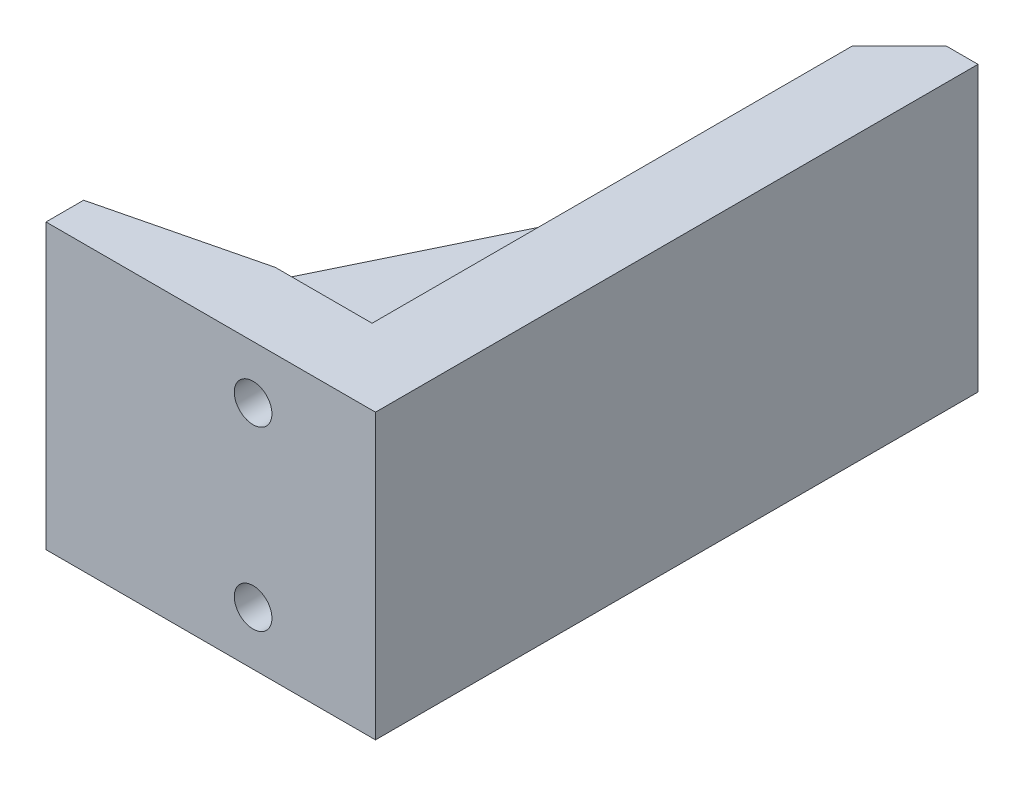
ISO-10303-21;
HEADER;
FILE_DESCRIPTION(('STEP AP214'),'2;1');
FILE_NAME('part.step','',(''),(''),'','','');
FILE_SCHEMA(('AUTOMOTIVE_DESIGN { 1 0 10303 214 1 1 1 1 }'));
ENDSEC;
DATA;
#1=APPLICATION_CONTEXT('core data for automotive mechanical design processes');
#2=APPLICATION_PROTOCOL_DEFINITION('international standard','automotive_design',2000,#1);
#3=PRODUCT_CONTEXT('',#1,'mechanical');
#4=PRODUCT('Part','Part','',(#3));
#5=PRODUCT_RELATED_PRODUCT_CATEGORY('part','',(#4));
#6=PRODUCT_DEFINITION_FORMATION('','',#4);
#7=PRODUCT_DEFINITION_CONTEXT('part definition',#1,'design');
#8=PRODUCT_DEFINITION('design','',#6,#7);
#9=PRODUCT_DEFINITION_SHAPE('','',#8);
#10=(LENGTH_UNIT() NAMED_UNIT(*) SI_UNIT(.MILLI.,.METRE.));
#11=(NAMED_UNIT(*) PLANE_ANGLE_UNIT() SI_UNIT($,.RADIAN.));
#12=(NAMED_UNIT(*) SI_UNIT($,.STERADIAN.) SOLID_ANGLE_UNIT());
#13=UNCERTAINTY_MEASURE_WITH_UNIT(LENGTH_MEASURE(1.E-05),#10,'distance_accuracy_value','');
#14=(GEOMETRIC_REPRESENTATION_CONTEXT(3) GLOBAL_UNCERTAINTY_ASSIGNED_CONTEXT((#13)) GLOBAL_UNIT_ASSIGNED_CONTEXT((#10,
#11,#12)) REPRESENTATION_CONTEXT('',''));
#15=CARTESIAN_POINT('',(0.,0.,0.));
#16=DIRECTION('',(0.,0.,1.));
#17=DIRECTION('',(1.,0.,0.));
#18=AXIS2_PLACEMENT_3D('',#15,#16,#17);
#19=CARTESIAN_POINT('',(0.,-11.225,0.));
#20=DIRECTION('',(0.,1.,0.));
#21=DIRECTION('',(0.,0.,1.));
#22=AXIS2_PLACEMENT_3D('',#19,#20,#21);
#23=PLANE('',#22);
#24=DIRECTION('',(0.971382108400301,0.,-0.237522208392787));
#25=VECTOR('',#24,1.);
#26=CARTESIAN_POINT('',(5.30770467836258,-11.225,0.));
#27=LINE('',#26,#25);
#28=CARTESIAN_POINT('',(-5.08,-11.225,2.54));
#29=VERTEX_POINT('',#28);
#30=CARTESIAN_POINT('',(5.30770467836258,-11.225,0.));
#31=VERTEX_POINT('',#30);
#32=EDGE_CURVE('E148',#29,#31,#27,.T.);
#33=ORIENTED_EDGE('',*,*,#32,.F.);
#34=DIRECTION('',(0.435941500457765,0.,-0.899975004196579));
#35=VECTOR('',#34,1.);
#36=CARTESIAN_POINT('',(11.835,-11.225,-32.38));
#37=LINE('',#36,#35);
#38=CARTESIAN_POINT('',(11.835,-11.225,-32.38));
#39=VERTEX_POINT('',#38);
#40=EDGE_CURVE('E152',#29,#39,#37,.T.);
#41=ORIENTED_EDGE('',*,*,#40,.T.);
#42=DIRECTION('',(0.,0.,1.));
#43=VECTOR('',#42,1.);
#44=CARTESIAN_POINT('',(11.835,-11.225,0.));
#45=LINE('',#44,#43);
#46=CARTESIAN_POINT('',(11.835,-11.225,0.));
#47=VERTEX_POINT('',#46);
#48=EDGE_CURVE('E151',#39,#47,#45,.T.);
#49=ORIENTED_EDGE('',*,*,#48,.T.);
#50=DIRECTION('',(-1.,0.,0.));
#51=VECTOR('',#50,1.);
#52=CARTESIAN_POINT('',(5.30770467836258,-11.225,0.));
#53=LINE('',#52,#51);
#54=EDGE_CURVE('E135',#47,#31,#53,.T.);
#55=ORIENTED_EDGE('',*,*,#54,.T.);
#56=EDGE_LOOP('',(#33,#41,#49,#55));
#57=FACE_BOUND('',#56,.T.);
#58=ADVANCED_FACE('F40',(#57),#23,.F.);
#59=CARTESIAN_POINT('',(0.,-5.915,0.));
#60=DIRECTION('',(0.,1.,0.));
#61=DIRECTION('',(0.,0.,1.));
#62=AXIS2_PLACEMENT_3D('',#59,#60,#61);
#63=PLANE('',#62);
#64=DIRECTION('',(0.435941500457765,0.,-0.899975004196579));
#65=VECTOR('',#64,1.);
#66=CARTESIAN_POINT('',(11.835,-5.915,-32.38));
#67=LINE('',#66,#65);
#68=CARTESIAN_POINT('',(-5.08,-5.915,2.54));
#69=VERTEX_POINT('',#68);
#70=CARTESIAN_POINT('',(11.835,-5.915,-32.38));
#71=VERTEX_POINT('',#70);
#72=EDGE_CURVE('E173',#69,#71,#67,.T.);
#73=ORIENTED_EDGE('',*,*,#72,.F.);
#74=DIRECTION('',(-0.971382108400301,0.,0.237522208392787));
#75=VECTOR('',#74,1.);
#76=CARTESIAN_POINT('',(5.30770467836258,-5.915,0.));
#77=LINE('',#76,#75);
#78=CARTESIAN_POINT('',(5.30770467836258,-5.915,0.));
#79=VERTEX_POINT('',#78);
#80=EDGE_CURVE('E160',#79,#69,#77,.T.);
#81=ORIENTED_EDGE('',*,*,#80,.F.);
#82=DIRECTION('',(-1.,0.,0.));
#83=VECTOR('',#82,1.);
#84=CARTESIAN_POINT('',(5.30770467836258,-5.915,0.));
#85=LINE('',#84,#83);
#86=CARTESIAN_POINT('',(11.835,-5.915,0.));
#87=VERTEX_POINT('',#86);
#88=EDGE_CURVE('E166',#87,#79,#85,.T.);
#89=ORIENTED_EDGE('',*,*,#88,.F.);
#90=DIRECTION('',(0.,0.,1.));
#91=VECTOR('',#90,1.);
#92=CARTESIAN_POINT('',(11.835,-5.915,0.));
#93=LINE('',#92,#91);
#94=EDGE_CURVE('E153',#71,#87,#93,.T.);
#95=ORIENTED_EDGE('',*,*,#94,.F.);
#96=EDGE_LOOP('',(#73,#81,#89,#95));
#97=FACE_BOUND('',#96,.T.);
#98=ADVANCED_FACE('F281',(#97),#63,.T.);
#99=CARTESIAN_POINT('',(0.,0.,0.));
#100=DIRECTION('',(0.,0.,1.));
#101=DIRECTION('',(1.,0.,0.));
#102=AXIS2_PLACEMENT_3D('',#99,#100,#101);
#103=PLANE('',#102);
#104=CARTESIAN_POINT('',(8.89,-14.5288,0.));
#105=DIRECTION('',(0.,0.,-1.));
#106=DIRECTION('',(-1.,0.,0.));
#107=AXIS2_PLACEMENT_3D('',#104,#105,#106);
#108=CIRCLE('',#107,2.54);
#109=CARTESIAN_POINT('',(6.35,-14.5288,0.));
#110=VERTEX_POINT('',#109);
#111=EDGE_CURVE('E235',#110,#110,#108,.T.);
#112=ORIENTED_EDGE('',*,*,#111,.F.);
#113=EDGE_LOOP('',(#112));
#114=FACE_BOUND('',#113,.T.);
#115=ORIENTED_EDGE('',*,*,#54,.F.);
#116=DIRECTION('',(0.,-1.,0.));
#117=VECTOR('',#116,1.);
#118=CARTESIAN_POINT('',(11.835,1.,0.));
#119=LINE('',#118,#117);
#120=CARTESIAN_POINT('',(11.835,-18.145,0.));
#121=VERTEX_POINT('',#120);
#122=EDGE_CURVE('E195',#47,#121,#119,.T.);
#123=ORIENTED_EDGE('',*,*,#122,.T.);
#124=DIRECTION('',(1.,0.,0.));
#125=VECTOR('',#124,1.);
#126=CARTESIAN_POINT('',(5.30770467836258,-18.145,0.));
#127=LINE('',#126,#125);
#128=CARTESIAN_POINT('',(5.30770467836258,-18.145,0.));
#129=VERTEX_POINT('',#128);
#130=EDGE_CURVE('E138',#129,#121,#127,.T.);
#131=ORIENTED_EDGE('',*,*,#130,.F.);
#132=DIRECTION('',(0.,1.,0.));
#133=VECTOR('',#132,1.);
#134=CARTESIAN_POINT('',(5.30770467836258,0.,0.));
#135=LINE('',#134,#133);
#136=EDGE_CURVE('E132',#129,#31,#135,.T.);
#137=ORIENTED_EDGE('',*,*,#136,.T.);
#138=EDGE_LOOP('',(#115,#123,#131,#137));
#139=FACE_BOUND('',#138,.T.);
#140=ADVANCED_FACE('F134',(#114,#139),#103,.F.);
#141=CARTESIAN_POINT('',(11.835,0.,0.));
#142=DIRECTION('',(1.,0.,0.));
#143=DIRECTION('',(0.,1.,0.));
#144=AXIS2_PLACEMENT_3D('',#141,#142,#143);
#145=PLANE('',#144);
#146=ORIENTED_EDGE('',*,*,#48,.F.);
#147=DIRECTION('',(0.,1.,0.));
#148=VECTOR('',#147,1.);
#149=CARTESIAN_POINT('',(11.835,-18.145,-32.38));
#150=LINE('',#149,#148);
#151=CARTESIAN_POINT('',(11.835,-18.145,-32.38));
#152=VERTEX_POINT('',#151);
#153=EDGE_CURVE('E191',#152,#39,#150,.T.);
#154=ORIENTED_EDGE('',*,*,#153,.F.);
#155=DIRECTION('',(0.,0.,-1.));
#156=VECTOR('',#155,1.);
#157=CARTESIAN_POINT('',(11.835,-18.145,0.));
#158=LINE('',#157,#156);
#159=EDGE_CURVE('E199',#121,#152,#158,.T.);
#160=ORIENTED_EDGE('',*,*,#159,.F.);
#161=ORIENTED_EDGE('',*,*,#122,.F.);
#162=EDGE_LOOP('',(#146,#154,#160,#161));
#163=FACE_BOUND('',#162,.T.);
#164=ADVANCED_FACE('F304',(#163),#145,.F.);
#165=CARTESIAN_POINT('',(8.89,-2.5908,0.));
#166=DIRECTION('',(0.,0.,-1.));
#167=DIRECTION('',(-1.,0.,0.));
#168=AXIS2_PLACEMENT_3D('',#165,#166,#167);
#169=CIRCLE('',#168,2.54);
#170=CARTESIAN_POINT('',(6.35,-2.5908,0.));
#171=VERTEX_POINT('',#170);
#172=EDGE_CURVE('E248',#171,#171,#169,.T.);
#173=ORIENTED_EDGE('',*,*,#172,.F.);
#174=EDGE_LOOP('',(#173));
#175=FACE_BOUND('',#174,.T.);
#176=CARTESIAN_POINT('',(11.835,1.,0.));
#177=VERTEX_POINT('',#176);
#178=EDGE_CURVE('E196',#177,#87,#119,.T.);
#179=ORIENTED_EDGE('',*,*,#178,.T.);
#180=ORIENTED_EDGE('',*,*,#88,.T.);
#181=CARTESIAN_POINT('',(5.30770467836258,1.,0.));
#182=VERTEX_POINT('',#181);
#183=EDGE_CURVE('E145',#79,#182,#135,.T.);
#184=ORIENTED_EDGE('',*,*,#183,.T.);
#185=DIRECTION('',(-1.,0.,0.));
#186=VECTOR('',#185,1.);
#187=CARTESIAN_POINT('',(17.145,1.,0.));
#188=LINE('',#187,#186);
#189=EDGE_CURVE('E221',#177,#182,#188,.T.);
#190=ORIENTED_EDGE('',*,*,#189,.F.);
#191=EDGE_LOOP('',(#179,#180,#184,#190));
#192=FACE_BOUND('',#191,.T.);
#193=ADVANCED_FACE('F275',(#175,#192),#103,.F.);
#194=CARTESIAN_POINT('',(8.89,-14.5288,5.08));
#195=DIRECTION('',(0.,0.,-1.));
#196=DIRECTION('',(-1.,0.,0.));
#197=AXIS2_PLACEMENT_3D('',#194,#195,#196);
#198=CYLINDRICAL_SURFACE('',#197,1.27);
#199=CARTESIAN_POINT('',(8.89,-14.5288,5.08));
#200=DIRECTION('',(0.,0.,-1.));
#201=DIRECTION('',(-1.,0.,0.));
#202=AXIS2_PLACEMENT_3D('',#199,#200,#201);
#203=CIRCLE('',#202,1.27);
#204=CARTESIAN_POINT('',(7.62,-14.5288,5.08));
#205=VERTEX_POINT('',#204);
#206=EDGE_CURVE('E252',#205,#205,#203,.T.);
#207=ORIENTED_EDGE('',*,*,#206,.F.);
#208=EDGE_LOOP('',(#207));
#209=FACE_BOUND('',#208,.T.);
#210=CARTESIAN_POINT('',(8.89,-14.5288,2.54));
#211=DIRECTION('',(0.,0.,-1.));
#212=DIRECTION('',(-1.,0.,0.));
#213=AXIS2_PLACEMENT_3D('',#210,#211,#212);
#214=CIRCLE('',#213,1.27);
#215=CARTESIAN_POINT('',(7.62,-14.5288,2.54));
#216=VERTEX_POINT('',#215);
#217=EDGE_CURVE('E44',#216,#216,#214,.F.);
#218=ORIENTED_EDGE('',*,*,#217,.F.);
#219=EDGE_LOOP('',(#218));
#220=FACE_BOUND('',#219,.T.);
#221=ADVANCED_FACE('F266',(#209,#220),#198,.F.);
#222=CARTESIAN_POINT('',(8.89,-2.5908,5.08));
#223=DIRECTION('',(0.,0.,-1.));
#224=DIRECTION('',(-1.,0.,0.));
#225=AXIS2_PLACEMENT_3D('',#222,#223,#224);
#226=CYLINDRICAL_SURFACE('',#225,1.27);
#227=CARTESIAN_POINT('',(8.89,-2.5908,5.08));
#228=DIRECTION('',(0.,0.,-1.));
#229=DIRECTION('',(-1.,0.,0.));
#230=AXIS2_PLACEMENT_3D('',#227,#228,#229);
#231=CIRCLE('',#230,1.27);
#232=CARTESIAN_POINT('',(7.62,-2.5908,5.08));
#233=VERTEX_POINT('',#232);
#234=EDGE_CURVE('E50',#233,#233,#231,.T.);
#235=ORIENTED_EDGE('',*,*,#234,.F.);
#236=EDGE_LOOP('',(#235));
#237=FACE_BOUND('',#236,.T.);
#238=CARTESIAN_POINT('',(8.89,-2.5908,2.54));
#239=DIRECTION('',(0.,0.,-1.));
#240=DIRECTION('',(-1.,0.,0.));
#241=AXIS2_PLACEMENT_3D('',#238,#239,#240);
#242=CIRCLE('',#241,1.27);
#243=CARTESIAN_POINT('',(7.62,-2.5908,2.54));
#244=VERTEX_POINT('',#243);
#245=EDGE_CURVE('E247',#244,#244,#242,.F.);
#246=ORIENTED_EDGE('',*,*,#245,.F.);
#247=EDGE_LOOP('',(#246));
#248=FACE_BOUND('',#247,.T.);
#249=ADVANCED_FACE('F264',(#237,#248),#226,.F.);
#250=CARTESIAN_POINT('',(17.145,0.,5.08));
#251=DIRECTION('',(-1.,0.,0.));
#252=DIRECTION('',(0.,-1.,0.));
#253=AXIS2_PLACEMENT_3D('',#250,#251,#252);
#254=PLANE('',#253);
#255=DIRECTION('',(0.,0.,1.));
#256=VECTOR('',#255,1.);
#257=CARTESIAN_POINT('',(17.145,-18.145,0.));
#258=LINE('',#257,#256);
#259=CARTESIAN_POINT('',(17.145,-18.145,-35.56));
#260=VERTEX_POINT('',#259);
#261=CARTESIAN_POINT('',(17.145,-18.145,5.08));
#262=VERTEX_POINT('',#261);
#263=EDGE_CURVE('E209',#260,#262,#258,.T.);
#264=ORIENTED_EDGE('',*,*,#263,.F.);
#265=DIRECTION('',(0.,1.,0.));
#266=VECTOR('',#265,1.);
#267=CARTESIAN_POINT('',(17.145,-18.145,-35.56));
#268=LINE('',#267,#266);
#269=CARTESIAN_POINT('',(17.145,1.00000000000001,-35.56));
#270=VERTEX_POINT('',#269);
#271=EDGE_CURVE('E190',#260,#270,#268,.T.);
#272=ORIENTED_EDGE('',*,*,#271,.T.);
#273=DIRECTION('',(0.,0.,-1.));
#274=VECTOR('',#273,1.);
#275=CARTESIAN_POINT('',(17.145,1.,5.08));
#276=LINE('',#275,#274);
#277=CARTESIAN_POINT('',(17.145,1.,5.08));
#278=VERTEX_POINT('',#277);
#279=EDGE_CURVE('E218',#278,#270,#276,.T.);
#280=ORIENTED_EDGE('',*,*,#279,.F.);
#281=DIRECTION('',(0.,1.,0.));
#282=VECTOR('',#281,1.);
#283=CARTESIAN_POINT('',(17.145,0.,5.08));
#284=LINE('',#283,#282);
#285=EDGE_CURVE('E11',#262,#278,#284,.T.);
#286=ORIENTED_EDGE('',*,*,#285,.F.);
#287=EDGE_LOOP('',(#264,#272,#280,#286));
#288=FACE_BOUND('',#287,.T.);
#289=ADVANCED_FACE('F42',(#288),#254,.F.);
#290=CARTESIAN_POINT('',(0.,0.,5.08));
#291=DIRECTION('',(0.,0.,1.));
#292=DIRECTION('',(1.,0.,0.));
#293=AXIS2_PLACEMENT_3D('',#290,#291,#292);
#294=PLANE('',#293);
#295=ORIENTED_EDGE('',*,*,#206,.T.);
#296=EDGE_LOOP('',(#295));
#297=FACE_BOUND('',#296,.T.);
#298=ORIENTED_EDGE('',*,*,#234,.T.);
#299=EDGE_LOOP('',(#298));
#300=FACE_BOUND('',#299,.T.);
#301=ORIENTED_EDGE('',*,*,#285,.T.);
#302=DIRECTION('',(1.,0.,0.));
#303=VECTOR('',#302,1.);
#304=CARTESIAN_POINT('',(-5.08,1.,5.08));
#305=LINE('',#304,#303);
#306=CARTESIAN_POINT('',(-5.08,1.,5.08));
#307=VERTEX_POINT('',#306);
#308=EDGE_CURVE('E227',#307,#278,#305,.T.);
#309=ORIENTED_EDGE('',*,*,#308,.F.);
#310=DIRECTION('',(0.,1.,0.));
#311=VECTOR('',#310,1.);
#312=CARTESIAN_POINT('',(-5.08,0.,5.08));
#313=LINE('',#312,#311);
#314=CARTESIAN_POINT('',(-5.08,-18.145,5.08));
#315=VERTEX_POINT('',#314);
#316=EDGE_CURVE('E144',#315,#307,#313,.T.);
#317=ORIENTED_EDGE('',*,*,#316,.F.);
#318=DIRECTION('',(-1.,0.,0.));
#319=VECTOR('',#318,1.);
#320=CARTESIAN_POINT('',(17.145,-18.145,5.08));
#321=LINE('',#320,#319);
#322=EDGE_CURVE('E212',#262,#315,#321,.T.);
#323=ORIENTED_EDGE('',*,*,#322,.F.);
#324=EDGE_LOOP('',(#301,#309,#317,#323));
#325=FACE_BOUND('',#324,.T.);
#326=ADVANCED_FACE('F273',(#297,#300,#325),#294,.T.);
#327=CARTESIAN_POINT('',(8.89,-2.5908,2.54));
#328=DIRECTION('',(0.,0.,-1.));
#329=DIRECTION('',(-1.,0.,0.));
#330=AXIS2_PLACEMENT_3D('',#327,#328,#329);
#331=PLANE('',#330);
#332=CARTESIAN_POINT('',(8.89,-2.5908,2.54));
#333=DIRECTION('',(0.,0.,-1.));
#334=DIRECTION('',(-1.,0.,0.));
#335=AXIS2_PLACEMENT_3D('',#332,#333,#334);
#336=CIRCLE('',#335,2.54);
#337=CARTESIAN_POINT('',(6.35,-2.5908,2.54));
#338=VERTEX_POINT('',#337);
#339=EDGE_CURVE('E243',#338,#338,#336,.T.);
#340=ORIENTED_EDGE('',*,*,#339,.T.);
#341=EDGE_LOOP('',(#340));
#342=FACE_BOUND('',#341,.T.);
#343=ORIENTED_EDGE('',*,*,#245,.T.);
#344=EDGE_LOOP('',(#343));
#345=FACE_BOUND('',#344,.T.);
#346=ADVANCED_FACE('F262',(#342,#345),#331,.T.);
#347=CARTESIAN_POINT('',(8.89,-2.5908,2.54));
#348=DIRECTION('',(0.,0.,-1.));
#349=DIRECTION('',(-1.,0.,0.));
#350=AXIS2_PLACEMENT_3D('',#347,#348,#349);
#351=CYLINDRICAL_SURFACE('',#350,2.54);
#352=ORIENTED_EDGE('',*,*,#339,.F.);
#353=EDGE_LOOP('',(#352));
#354=FACE_BOUND('',#353,.T.);
#355=ORIENTED_EDGE('',*,*,#172,.T.);
#356=EDGE_LOOP('',(#355));
#357=FACE_BOUND('',#356,.T.);
#358=ADVANCED_FACE('F324',(#354,#357),#351,.F.);
#359=CARTESIAN_POINT('',(8.89,-14.5288,2.54));
#360=DIRECTION('',(0.,0.,-1.));
#361=DIRECTION('',(-1.,0.,0.));
#362=AXIS2_PLACEMENT_3D('',#359,#360,#361);
#363=PLANE('',#362);
#364=CARTESIAN_POINT('',(8.89,-14.5288,2.54));
#365=DIRECTION('',(0.,0.,-1.));
#366=DIRECTION('',(-1.,0.,0.));
#367=AXIS2_PLACEMENT_3D('',#364,#365,#366);
#368=CIRCLE('',#367,2.54);
#369=CARTESIAN_POINT('',(6.35,-14.5288,2.54));
#370=VERTEX_POINT('',#369);
#371=EDGE_CURVE('E236',#370,#370,#368,.T.);
#372=ORIENTED_EDGE('',*,*,#371,.T.);
#373=EDGE_LOOP('',(#372));
#374=FACE_BOUND('',#373,.T.);
#375=ORIENTED_EDGE('',*,*,#217,.T.);
#376=EDGE_LOOP('',(#375));
#377=FACE_BOUND('',#376,.T.);
#378=ADVANCED_FACE('F321',(#374,#377),#363,.T.);
#379=CARTESIAN_POINT('',(8.89,-14.5288,2.54));
#380=DIRECTION('',(0.,0.,-1.));
#381=DIRECTION('',(-1.,0.,0.));
#382=AXIS2_PLACEMENT_3D('',#379,#380,#381);
#383=CYLINDRICAL_SURFACE('',#382,2.54);
#384=ORIENTED_EDGE('',*,*,#371,.F.);
#385=EDGE_LOOP('',(#384));
#386=FACE_BOUND('',#385,.T.);
#387=ORIENTED_EDGE('',*,*,#111,.T.);
#388=EDGE_LOOP('',(#387));
#389=FACE_BOUND('',#388,.T.);
#390=ADVANCED_FACE('F319',(#386,#389),#383,.F.);
#391=CARTESIAN_POINT('',(-5.08,0.,0.));
#392=DIRECTION('',(1.,0.,0.));
#393=DIRECTION('',(0.,0.,-1.));
#394=AXIS2_PLACEMENT_3D('',#391,#392,#393);
#395=PLANE('',#394);
#396=ORIENTED_EDGE('',*,*,#316,.T.);
#397=DIRECTION('',(0.,0.,1.));
#398=VECTOR('',#397,1.);
#399=CARTESIAN_POINT('',(-5.08,1.,2.54));
#400=LINE('',#399,#398);
#401=CARTESIAN_POINT('',(-5.08,1.,2.54));
#402=VERTEX_POINT('',#401);
#403=EDGE_CURVE('E224',#402,#307,#400,.T.);
#404=ORIENTED_EDGE('',*,*,#403,.F.);
#405=DIRECTION('',(0.,-1.,0.));
#406=VECTOR('',#405,1.);
#407=CARTESIAN_POINT('',(-5.08,0.,2.54));
#408=LINE('',#407,#406);
#409=EDGE_CURVE('E231',#402,#69,#408,.T.);
#410=ORIENTED_EDGE('',*,*,#409,.T.);
#411=DIRECTION('',(0.,1.,0.));
#412=VECTOR('',#411,1.);
#413=CARTESIAN_POINT('',(-5.08,-11.225,2.54));
#414=LINE('',#413,#412);
#415=EDGE_CURVE('E179',#29,#69,#414,.T.);
#416=ORIENTED_EDGE('',*,*,#415,.F.);
#417=CARTESIAN_POINT('',(-5.08,-18.145,2.54));
#418=VERTEX_POINT('',#417);
#419=EDGE_CURVE('E157',#29,#418,#408,.T.);
#420=ORIENTED_EDGE('',*,*,#419,.T.);
#421=DIRECTION('',(0.,0.,-1.));
#422=VECTOR('',#421,1.);
#423=CARTESIAN_POINT('',(-5.08,-18.145,5.08));
#424=LINE('',#423,#422);
#425=EDGE_CURVE('E215',#315,#418,#424,.T.);
#426=ORIENTED_EDGE('',*,*,#425,.F.);
#427=EDGE_LOOP('',(#396,#404,#410,#416,#420,#426));
#428=FACE_BOUND('',#427,.T.);
#429=ADVANCED_FACE('F315',(#428),#395,.F.);
#430=CARTESIAN_POINT('',(0.,1.,0.));
#431=DIRECTION('',(0.,1.,0.));
#432=DIRECTION('',(0.,0.,1.));
#433=AXIS2_PLACEMENT_3D('',#430,#431,#432);
#434=PLANE('',#433);
#435=DIRECTION('',(-0.971382108400301,0.,0.237522208392787));
#436=VECTOR('',#435,1.);
#437=CARTESIAN_POINT('',(5.30770467836258,1.,0.));
#438=LINE('',#437,#436);
#439=EDGE_CURVE('E164',#182,#402,#438,.T.);
#440=ORIENTED_EDGE('',*,*,#439,.T.);
#441=ORIENTED_EDGE('',*,*,#403,.T.);
#442=ORIENTED_EDGE('',*,*,#308,.T.);
#443=ORIENTED_EDGE('',*,*,#279,.T.);
#444=DIRECTION('',(1.,0.,0.));
#445=VECTOR('',#444,1.);
#446=CARTESIAN_POINT('',(11.835,1.00000000000001,-35.56));
#447=LINE('',#446,#445);
#448=CARTESIAN_POINT('',(15.015,1.,-35.56));
#449=VERTEX_POINT('',#448);
#450=EDGE_CURVE('E205',#449,#270,#447,.T.);
#451=ORIENTED_EDGE('',*,*,#450,.F.);
#452=DIRECTION('',(0.707106781186551,0.,-0.707106781186544));
#453=VECTOR('',#452,1.);
#454=CARTESIAN_POINT('',(15.015,1.,-35.56));
#455=LINE('',#454,#453);
#456=CARTESIAN_POINT('',(11.835,1.,-32.38));
#457=VERTEX_POINT('',#456);
#458=EDGE_CURVE('E183',#457,#449,#455,.T.);
#459=ORIENTED_EDGE('',*,*,#458,.F.);
#460=DIRECTION('',(0.,0.,1.));
#461=VECTOR('',#460,1.);
#462=CARTESIAN_POINT('',(11.835,1.,-17.78));
#463=LINE('',#462,#461);
#464=EDGE_CURVE('E193',#457,#177,#463,.T.);
#465=ORIENTED_EDGE('',*,*,#464,.T.);
#466=ORIENTED_EDGE('',*,*,#189,.T.);
#467=EDGE_LOOP('',(#440,#441,#442,#443,#451,#459,#465,#466));
#468=FACE_BOUND('',#467,.T.);
#469=ADVANCED_FACE('F311',(#468),#434,.T.);
#470=CARTESIAN_POINT('',(0.,-18.145,0.));
#471=DIRECTION('',(0.,-1.,0.));
#472=DIRECTION('',(0.,0.,-1.));
#473=AXIS2_PLACEMENT_3D('',#470,#471,#472);
#474=PLANE('',#473);
#475=DIRECTION('',(0.971382108400301,0.,-0.237522208392787));
#476=VECTOR('',#475,1.);
#477=CARTESIAN_POINT('',(5.30770467836258,-18.145,0.));
#478=LINE('',#477,#476);
#479=EDGE_CURVE('E158',#418,#129,#478,.T.);
#480=ORIENTED_EDGE('',*,*,#479,.T.);
#481=ORIENTED_EDGE('',*,*,#130,.T.);
#482=ORIENTED_EDGE('',*,*,#159,.T.);
#483=DIRECTION('',(0.707106781186551,0.,-0.707106781186544));
#484=VECTOR('',#483,1.);
#485=CARTESIAN_POINT('',(15.015,-18.145,-35.56));
#486=LINE('',#485,#484);
#487=CARTESIAN_POINT('',(15.015,-18.145,-35.56));
#488=VERTEX_POINT('',#487);
#489=EDGE_CURVE('E58',#152,#488,#486,.T.);
#490=ORIENTED_EDGE('',*,*,#489,.T.);
#491=DIRECTION('',(1.,0.,0.));
#492=VECTOR('',#491,1.);
#493=CARTESIAN_POINT('',(11.835,-18.145,-35.56));
#494=LINE('',#493,#492);
#495=EDGE_CURVE('E202',#488,#260,#494,.T.);
#496=ORIENTED_EDGE('',*,*,#495,.T.);
#497=ORIENTED_EDGE('',*,*,#263,.T.);
#498=ORIENTED_EDGE('',*,*,#322,.T.);
#499=ORIENTED_EDGE('',*,*,#425,.T.);
#500=EDGE_LOOP('',(#480,#481,#482,#490,#496,#497,#498,#499));
#501=FACE_BOUND('',#500,.T.);
#502=ADVANCED_FACE('F307',(#501),#474,.T.);
#503=CARTESIAN_POINT('',(11.835,-18.145,-35.56));
#504=DIRECTION('',(0.,0.,-1.));
#505=DIRECTION('',(-1.,0.,0.));
#506=AXIS2_PLACEMENT_3D('',#503,#504,#505);
#507=PLANE('',#506);
#508=DIRECTION('',(0.,1.,0.));
#509=VECTOR('',#508,1.);
#510=CARTESIAN_POINT('',(15.015,-18.145,-35.56));
#511=LINE('',#510,#509);
#512=EDGE_CURVE('E187',#488,#449,#511,.T.);
#513=ORIENTED_EDGE('',*,*,#512,.T.);
#514=ORIENTED_EDGE('',*,*,#450,.T.);
#515=ORIENTED_EDGE('',*,*,#271,.F.);
#516=ORIENTED_EDGE('',*,*,#495,.F.);
#517=EDGE_LOOP('',(#513,#514,#515,#516));
#518=FACE_BOUND('',#517,.T.);
#519=ADVANCED_FACE('F302',(#518),#507,.T.);
#520=EDGE_CURVE('E185',#71,#457,#150,.T.);
#521=ORIENTED_EDGE('',*,*,#520,.F.);
#522=ORIENTED_EDGE('',*,*,#94,.T.);
#523=ORIENTED_EDGE('',*,*,#178,.F.);
#524=ORIENTED_EDGE('',*,*,#464,.F.);
#525=EDGE_LOOP('',(#521,#522,#523,#524));
#526=FACE_BOUND('',#525,.T.);
#527=ADVANCED_FACE('F299',(#526),#145,.F.);
#528=CARTESIAN_POINT('',(15.015,-18.145,-35.56));
#529=DIRECTION('',(0.707106781186544,0.,0.707106781186551));
#530=DIRECTION('',(0.707106781186551,0.,-0.707106781186544));
#531=AXIS2_PLACEMENT_3D('',#528,#529,#530);
#532=PLANE('',#531);
#533=ORIENTED_EDGE('',*,*,#458,.T.);
#534=ORIENTED_EDGE('',*,*,#512,.F.);
#535=ORIENTED_EDGE('',*,*,#489,.F.);
#536=ORIENTED_EDGE('',*,*,#153,.T.);
#537=DIRECTION('',(0.,1.,0.));
#538=VECTOR('',#537,1.);
#539=CARTESIAN_POINT('',(11.835,-11.225,-32.38));
#540=LINE('',#539,#538);
#541=EDGE_CURVE('E170',#39,#71,#540,.T.);
#542=ORIENTED_EDGE('',*,*,#541,.T.);
#543=ORIENTED_EDGE('',*,*,#520,.T.);
#544=EDGE_LOOP('',(#533,#534,#535,#536,#542,#543));
#545=FACE_BOUND('',#544,.T.);
#546=ADVANCED_FACE('F295',(#545),#532,.F.);
#547=CARTESIAN_POINT('',(11.835,-11.225,-32.38));
#548=DIRECTION('',(0.899975004196579,0.,0.435941500457765));
#549=DIRECTION('',(0.435941500457765,0.,-0.899975004196579));
#550=AXIS2_PLACEMENT_3D('',#547,#548,#549);
#551=PLANE('',#550);
#552=ORIENTED_EDGE('',*,*,#72,.T.);
#553=ORIENTED_EDGE('',*,*,#541,.F.);
#554=ORIENTED_EDGE('',*,*,#40,.F.);
#555=ORIENTED_EDGE('',*,*,#415,.T.);
#556=EDGE_LOOP('',(#552,#553,#554,#555));
#557=FACE_BOUND('',#556,.T.);
#558=ADVANCED_FACE('F292',(#557),#551,.F.);
#559=CARTESIAN_POINT('',(5.30770467836258,11.6937368812252,0.));
#560=DIRECTION('',(0.237522208392787,0.,0.971382108400301));
#561=DIRECTION('',(0.971382108400301,0.,-0.237522208392787));
#562=AXIS2_PLACEMENT_3D('',#559,#560,#561);
#563=PLANE('',#562);
#564=ORIENTED_EDGE('',*,*,#439,.F.);
#565=ORIENTED_EDGE('',*,*,#183,.F.);
#566=ORIENTED_EDGE('',*,*,#80,.T.);
#567=ORIENTED_EDGE('',*,*,#409,.F.);
#568=EDGE_LOOP('',(#564,#565,#566,#567));
#569=FACE_BOUND('',#568,.T.);
#570=ADVANCED_FACE('F289',(#569),#563,.F.);
#571=CARTESIAN_POINT('',(5.30770467836258,-28.8387368812252,0.));
#572=DIRECTION('',(0.237522208392787,0.,0.971382108400301));
#573=DIRECTION('',(0.971382108400301,0.,-0.237522208392787));
#574=AXIS2_PLACEMENT_3D('',#571,#572,#573);
#575=PLANE('',#574);
#576=ORIENTED_EDGE('',*,*,#479,.F.);
#577=ORIENTED_EDGE('',*,*,#419,.F.);
#578=ORIENTED_EDGE('',*,*,#32,.T.);
#579=ORIENTED_EDGE('',*,*,#136,.F.);
#580=EDGE_LOOP('',(#576,#577,#578,#579));
#581=FACE_BOUND('',#580,.T.);
#582=ADVANCED_FACE('F156',(#581),#575,.F.);
#583=CLOSED_SHELL('',(#58,#98,#140,#164,#193,#221,#249,#289,#326,#346,#358,#378,#390,#429,#469,
#502,#519,#527,#546,#558,#570,#582));
#584=MANIFOLD_SOLID_BREP('B2',#583);
#585=ADVANCED_BREP_SHAPE_REPRESENTATION('',(#18,#584),#14);
#586=SHAPE_DEFINITION_REPRESENTATION(#9,#585);
ENDSEC;
END-ISO-10303-21;
